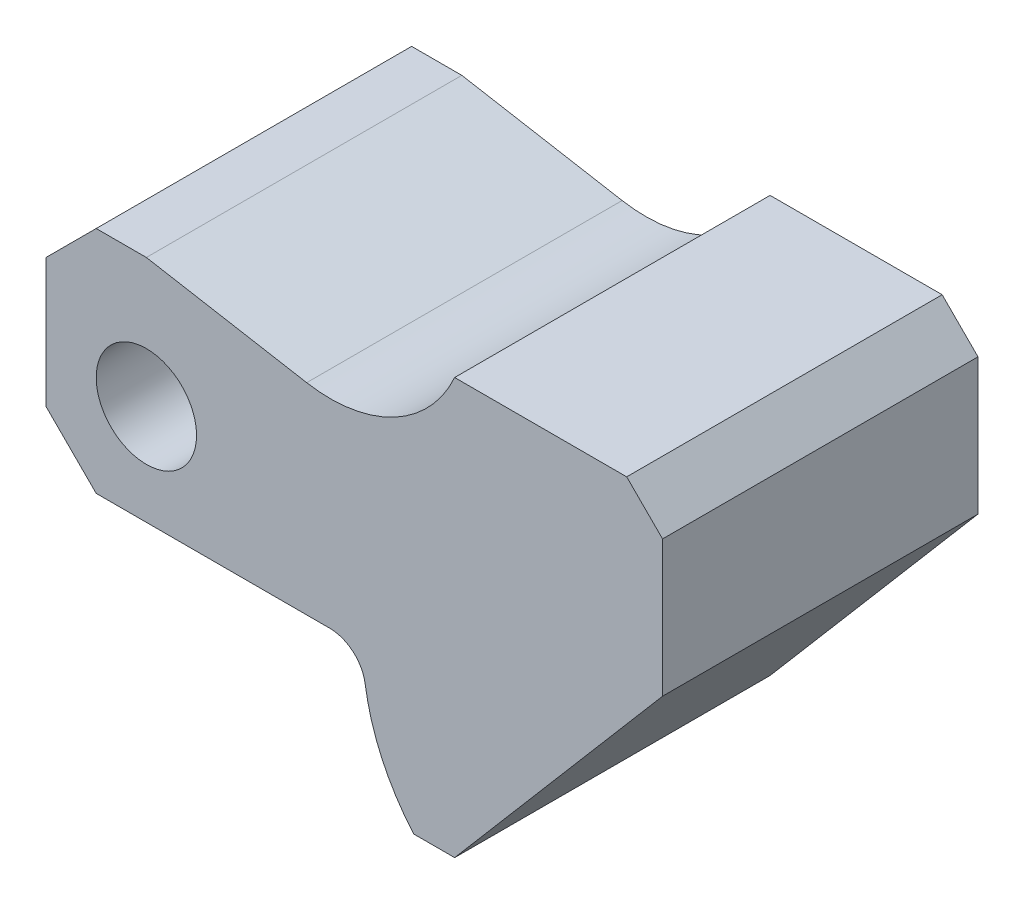
ISO-10303-21;
HEADER;
FILE_DESCRIPTION(('STEP AP214'),'2;1');
FILE_NAME('part.step','',(''),(''),'','','');
FILE_SCHEMA(('AUTOMOTIVE_DESIGN { 1 0 10303 214 1 1 1 1 }'));
ENDSEC;
DATA;
#1=APPLICATION_CONTEXT('core data for automotive mechanical design processes');
#2=APPLICATION_PROTOCOL_DEFINITION('international standard','automotive_design',2000,#1);
#3=PRODUCT_CONTEXT('',#1,'mechanical');
#4=PRODUCT('Part','Part','',(#3));
#5=PRODUCT_RELATED_PRODUCT_CATEGORY('part','',(#4));
#6=PRODUCT_DEFINITION_FORMATION('','',#4);
#7=PRODUCT_DEFINITION_CONTEXT('part definition',#1,'design');
#8=PRODUCT_DEFINITION('design','',#6,#7);
#9=PRODUCT_DEFINITION_SHAPE('','',#8);
#10=(LENGTH_UNIT() NAMED_UNIT(*) SI_UNIT(.MILLI.,.METRE.));
#11=(NAMED_UNIT(*) PLANE_ANGLE_UNIT() SI_UNIT($,.RADIAN.));
#12=(NAMED_UNIT(*) SI_UNIT($,.STERADIAN.) SOLID_ANGLE_UNIT());
#13=UNCERTAINTY_MEASURE_WITH_UNIT(LENGTH_MEASURE(1.E-05),#10,'distance_accuracy_value','');
#14=(GEOMETRIC_REPRESENTATION_CONTEXT(3) GLOBAL_UNCERTAINTY_ASSIGNED_CONTEXT((#13)) GLOBAL_UNIT_ASSIGNED_CONTEXT((#10,
#11,#12)) REPRESENTATION_CONTEXT('',''));
#15=CARTESIAN_POINT('',(0.,0.,0.));
#16=DIRECTION('',(0.,0.,1.));
#17=DIRECTION('',(1.,0.,0.));
#18=AXIS2_PLACEMENT_3D('',#15,#16,#17);
#19=CARTESIAN_POINT('',(-153.475211561993,21.7593578120713,44.));
#20=DIRECTION('',(0.,1.,0.));
#21=DIRECTION('',(-1.,0.,0.));
#22=AXIS2_PLACEMENT_3D('',#19,#20,#21);
#23=PLANE('',#22);
#24=DIRECTION('',(1.,0.,0.));
#25=VECTOR('',#24,1.);
#26=CARTESIAN_POINT('',(-153.475211561993,21.7593578120713,44.));
#27=LINE('',#26,#25);
#28=CARTESIAN_POINT('',(-146.475211561993,21.7593578120713,44.));
#29=VERTEX_POINT('',#28);
#30=CARTESIAN_POINT('',(-113.899672650652,21.7593578120713,44.));
#31=VERTEX_POINT('',#30);
#32=EDGE_CURVE('E146',#29,#31,#27,.T.);
#33=ORIENTED_EDGE('',*,*,#32,.F.);
#34=DIRECTION('',(0.,0.,-1.));
#35=VECTOR('',#34,1.);
#36=CARTESIAN_POINT('',(-146.475211561993,21.7593578120713,44.));
#37=LINE('',#36,#35);
#38=CARTESIAN_POINT('',(-146.475211561993,21.7593578120713,0.));
#39=VERTEX_POINT('',#38);
#40=EDGE_CURVE('E186',#29,#39,#37,.T.);
#41=ORIENTED_EDGE('',*,*,#40,.T.);
#42=DIRECTION('',(1.,0.,0.));
#43=VECTOR('',#42,1.);
#44=CARTESIAN_POINT('',(-153.475211561993,21.7593578120713,0.));
#45=LINE('',#44,#43);
#46=CARTESIAN_POINT('',(-113.899672650652,21.7593578120713,0.));
#47=VERTEX_POINT('',#46);
#48=EDGE_CURVE('E170',#39,#47,#45,.T.);
#49=ORIENTED_EDGE('',*,*,#48,.T.);
#50=DIRECTION('',(0.,0.,-1.));
#51=VECTOR('',#50,1.);
#52=CARTESIAN_POINT('',(-113.899672650652,21.7593578120713,44.));
#53=LINE('',#52,#51);
#54=EDGE_CURVE('E163',#31,#47,#53,.T.);
#55=ORIENTED_EDGE('',*,*,#54,.F.);
#56=EDGE_LOOP('',(#33,#41,#49,#55));
#57=FACE_BOUND('',#56,.T.);
#58=ADVANCED_FACE('F45',(#57),#23,.F.);
#59=CARTESIAN_POINT('',(-113.899672650652,16.7593578120713,44.));
#60=DIRECTION('',(0.,0.,-1.));
#61=DIRECTION('',(-1.,0.,0.));
#62=AXIS2_PLACEMENT_3D('',#59,#60,#61);
#63=CYLINDRICAL_SURFACE('',#62,5.);
#64=CARTESIAN_POINT('',(-113.899672650652,16.7593578120713,0.));
#65=DIRECTION('',(0.,0.,-1.));
#66=DIRECTION('',(-1.,0.,0.));
#67=AXIS2_PLACEMENT_3D('',#64,#65,#66);
#68=CIRCLE('',#67,5.);
#69=CARTESIAN_POINT('',(-108.95403390924,17.4946519297184,0.));
#70=VERTEX_POINT('',#69);
#71=EDGE_CURVE('E252',#47,#70,#68,.T.);
#72=ORIENTED_EDGE('',*,*,#71,.T.);
#73=DIRECTION('',(0.,0.,-1.));
#74=VECTOR('',#73,1.);
#75=CARTESIAN_POINT('',(-108.95403390924,17.4946519297184,44.));
#76=LINE('',#75,#74);
#77=CARTESIAN_POINT('',(-108.95403390924,17.4946519297184,44.));
#78=VERTEX_POINT('',#77);
#79=EDGE_CURVE('E165',#78,#70,#76,.T.);
#80=ORIENTED_EDGE('',*,*,#79,.F.);
#81=CARTESIAN_POINT('',(-113.899672650652,16.7593578120713,44.));
#82=DIRECTION('',(0.,0.,-1.));
#83=DIRECTION('',(-1.,0.,0.));
#84=AXIS2_PLACEMENT_3D('',#81,#82,#83);
#85=CIRCLE('',#84,5.);
#86=EDGE_CURVE('E149',#31,#78,#85,.T.);
#87=ORIENTED_EDGE('',*,*,#86,.F.);
#88=ORIENTED_EDGE('',*,*,#54,.T.);
#89=EDGE_LOOP('',(#72,#80,#87,#88));
#90=FACE_BOUND('',#89,.T.);
#91=ADVANCED_FACE('F162',(#90),#63,.F.);
#92=CARTESIAN_POINT('',(-80.2693292090515,21.7593578120713,44.));
#93=DIRECTION('',(0.,0.,-1.));
#94=DIRECTION('',(-1.,0.,0.));
#95=AXIS2_PLACEMENT_3D('',#92,#93,#94);
#96=CYLINDRICAL_SURFACE('',#95,29.);
#97=CARTESIAN_POINT('',(-80.2693292090515,21.7593578120713,0.));
#98=DIRECTION('',(0.,0.,1.));
#99=DIRECTION('',(1.,0.,0.));
#100=AXIS2_PLACEMENT_3D('',#97,#98,#99);
#101=CIRCLE('',#100,29.);
#102=CARTESIAN_POINT('',(-102.178231509258,2.75935781207131,0.));
#103=VERTEX_POINT('',#102);
#104=EDGE_CURVE('E250',#70,#103,#101,.T.);
#105=ORIENTED_EDGE('',*,*,#104,.T.);
#106=DIRECTION('',(0.,0.,-1.));
#107=VECTOR('',#106,1.);
#108=CARTESIAN_POINT('',(-102.178231509258,2.75935781207131,44.));
#109=LINE('',#108,#107);
#110=CARTESIAN_POINT('',(-102.178231509258,2.75935781207131,44.));
#111=VERTEX_POINT('',#110);
#112=EDGE_CURVE('E177',#111,#103,#109,.T.);
#113=ORIENTED_EDGE('',*,*,#112,.F.);
#114=CARTESIAN_POINT('',(-80.2693292090515,21.7593578120713,44.));
#115=DIRECTION('',(0.,0.,1.));
#116=DIRECTION('',(1.,0.,0.));
#117=AXIS2_PLACEMENT_3D('',#114,#115,#116);
#118=CIRCLE('',#117,29.);
#119=EDGE_CURVE('E167',#78,#111,#118,.T.);
#120=ORIENTED_EDGE('',*,*,#119,.F.);
#121=ORIENTED_EDGE('',*,*,#79,.T.);
#122=EDGE_LOOP('',(#105,#113,#120,#121));
#123=FACE_BOUND('',#122,.T.);
#124=ADVANCED_FACE('F302',(#123),#96,.T.);
#125=CARTESIAN_POINT('',(-96.4752115619927,2.75935781207131,44.));
#126=DIRECTION('',(0.,1.,0.));
#127=DIRECTION('',(0.,0.,1.));
#128=AXIS2_PLACEMENT_3D('',#125,#126,#127);
#129=PLANE('',#128);
#130=DIRECTION('',(1.,0.,0.));
#131=VECTOR('',#130,1.);
#132=CARTESIAN_POINT('',(-96.4752115619927,2.75935781207131,0.));
#133=LINE('',#132,#131);
#134=CARTESIAN_POINT('',(-96.4752115619927,2.75935781207131,0.));
#135=VERTEX_POINT('',#134);
#136=EDGE_CURVE('E245',#103,#135,#133,.T.);
#137=ORIENTED_EDGE('',*,*,#136,.T.);
#138=DIRECTION('',(0.,0.,-1.));
#139=VECTOR('',#138,1.);
#140=CARTESIAN_POINT('',(-96.4752115619927,2.75935781207131,44.));
#141=LINE('',#140,#139);
#142=CARTESIAN_POINT('',(-96.4752115619927,2.75935781207131,44.));
#143=VERTEX_POINT('',#142);
#144=EDGE_CURVE('E236',#143,#135,#141,.T.);
#145=ORIENTED_EDGE('',*,*,#144,.F.);
#146=DIRECTION('',(1.,0.,0.));
#147=VECTOR('',#146,1.);
#148=CARTESIAN_POINT('',(-96.4752115619927,2.75935781207131,44.));
#149=LINE('',#148,#147);
#150=EDGE_CURVE('E246',#111,#143,#149,.T.);
#151=ORIENTED_EDGE('',*,*,#150,.F.);
#152=ORIENTED_EDGE('',*,*,#112,.T.);
#153=EDGE_LOOP('',(#137,#145,#151,#152));
#154=FACE_BOUND('',#153,.T.);
#155=ADVANCED_FACE('F243',(#154),#129,.F.);
#156=CARTESIAN_POINT('',(-67.4752115619927,36.7593578120713,44.));
#157=DIRECTION('',(-0.760833951959086,0.64894660608275,0.));
#158=DIRECTION('',(-0.64894660608275,-0.760833951959086,0.));
#159=AXIS2_PLACEMENT_3D('',#156,#157,#158);
#160=PLANE('',#159);
#161=DIRECTION('',(0.64894660608275,0.760833951959086,0.));
#162=VECTOR('',#161,1.);
#163=CARTESIAN_POINT('',(-67.4752115619927,36.7593578120713,0.));
#164=LINE('',#163,#162);
#165=CARTESIAN_POINT('',(-67.4752115619927,36.7593578120713,0.));
#166=VERTEX_POINT('',#165);
#167=EDGE_CURVE('E214',#135,#166,#164,.T.);
#168=ORIENTED_EDGE('',*,*,#167,.T.);
#169=DIRECTION('',(0.,0.,-1.));
#170=VECTOR('',#169,1.);
#171=CARTESIAN_POINT('',(-67.4752115619927,36.7593578120713,44.));
#172=LINE('',#171,#170);
#173=CARTESIAN_POINT('',(-67.4752115619927,36.7593578120713,44.));
#174=VERTEX_POINT('',#173);
#175=EDGE_CURVE('E233',#174,#166,#172,.T.);
#176=ORIENTED_EDGE('',*,*,#175,.F.);
#177=DIRECTION('',(0.64894660608275,0.760833951959086,0.));
#178=VECTOR('',#177,1.);
#179=CARTESIAN_POINT('',(-67.4752115619927,36.7593578120713,44.));
#180=LINE('',#179,#178);
#181=EDGE_CURVE('E269',#143,#174,#180,.T.);
#182=ORIENTED_EDGE('',*,*,#181,.F.);
#183=ORIENTED_EDGE('',*,*,#144,.T.);
#184=EDGE_LOOP('',(#168,#176,#182,#183));
#185=FACE_BOUND('',#184,.T.);
#186=ADVANCED_FACE('F326',(#185),#160,.F.);
#187=CARTESIAN_POINT('',(-67.4752115619927,60.7593578120713,44.));
#188=DIRECTION('',(-1.,0.,0.));
#189=DIRECTION('',(0.,0.,1.));
#190=AXIS2_PLACEMENT_3D('',#187,#188,#189);
#191=PLANE('',#190);
#192=DIRECTION('',(0.,1.,0.));
#193=VECTOR('',#192,1.);
#194=CARTESIAN_POINT('',(-67.4752115619927,60.7593578120713,0.));
#195=LINE('',#194,#193);
#196=CARTESIAN_POINT('',(-67.4752115619927,55.7593578120713,0.));
#197=VERTEX_POINT('',#196);
#198=EDGE_CURVE('E210',#166,#197,#195,.T.);
#199=ORIENTED_EDGE('',*,*,#198,.T.);
#200=DIRECTION('',(0.,0.,1.));
#201=VECTOR('',#200,1.);
#202=CARTESIAN_POINT('',(-67.4752115619927,55.7593578120713,44.));
#203=LINE('',#202,#201);
#204=CARTESIAN_POINT('',(-67.4752115619927,55.7593578120713,44.));
#205=VERTEX_POINT('',#204);
#206=EDGE_CURVE('E54',#197,#205,#203,.T.);
#207=ORIENTED_EDGE('',*,*,#206,.T.);
#208=DIRECTION('',(0.,1.,0.));
#209=VECTOR('',#208,1.);
#210=CARTESIAN_POINT('',(-67.4752115619927,60.7593578120713,44.));
#211=LINE('',#210,#209);
#212=EDGE_CURVE('E267',#174,#205,#211,.T.);
#213=ORIENTED_EDGE('',*,*,#212,.F.);
#214=ORIENTED_EDGE('',*,*,#175,.T.);
#215=EDGE_LOOP('',(#199,#207,#213,#214));
#216=FACE_BOUND('',#215,.T.);
#217=ADVANCED_FACE('F327',(#216),#191,.F.);
#218=CARTESIAN_POINT('',(-96.4752115619927,60.7593578120713,44.));
#219=DIRECTION('',(0.,-1.,0.));
#220=DIRECTION('',(0.,0.,-1.));
#221=AXIS2_PLACEMENT_3D('',#218,#219,#220);
#222=PLANE('',#221);
#223=DIRECTION('',(-1.,0.,0.));
#224=VECTOR('',#223,1.);
#225=CARTESIAN_POINT('',(-96.4752115619927,60.7593578120713,44.));
#226=LINE('',#225,#224);
#227=CARTESIAN_POINT('',(-72.4752115619927,60.7593578120713,44.));
#228=VERTEX_POINT('',#227);
#229=CARTESIAN_POINT('',(-96.4752115619927,60.7593578120713,44.));
#230=VERTEX_POINT('',#229);
#231=EDGE_CURVE('E203',#228,#230,#226,.T.);
#232=ORIENTED_EDGE('',*,*,#231,.F.);
#233=DIRECTION('',(0.,0.,-1.));
#234=VECTOR('',#233,1.);
#235=CARTESIAN_POINT('',(-72.4752115619927,60.7593578120713,44.));
#236=LINE('',#235,#234);
#237=CARTESIAN_POINT('',(-72.4752115619927,60.7593578120713,0.));
#238=VERTEX_POINT('',#237);
#239=EDGE_CURVE('E193',#228,#238,#236,.T.);
#240=ORIENTED_EDGE('',*,*,#239,.T.);
#241=DIRECTION('',(-1.,0.,0.));
#242=VECTOR('',#241,1.);
#243=CARTESIAN_POINT('',(-96.4752115619927,60.7593578120713,0.));
#244=LINE('',#243,#242);
#245=CARTESIAN_POINT('',(-96.4752115619927,60.7593578120713,0.));
#246=VERTEX_POINT('',#245);
#247=EDGE_CURVE('E201',#238,#246,#244,.T.);
#248=ORIENTED_EDGE('',*,*,#247,.T.);
#249=DIRECTION('',(0.,0.,-1.));
#250=VECTOR('',#249,1.);
#251=CARTESIAN_POINT('',(-96.4752115619927,60.7593578120713,44.));
#252=LINE('',#251,#250);
#253=EDGE_CURVE('E231',#230,#246,#252,.T.);
#254=ORIENTED_EDGE('',*,*,#253,.F.);
#255=EDGE_LOOP('',(#232,#240,#248,#254));
#256=FACE_BOUND('',#255,.T.);
#257=ADVANCED_FACE('F199',(#256),#222,.F.);
#258=CARTESIAN_POINT('',(-113.814515350544,68.5277903520585,44.));
#259=DIRECTION('',(0.,0.,-1.));
#260=DIRECTION('',(-1.,0.,0.));
#261=AXIS2_PLACEMENT_3D('',#258,#259,#260);
#262=CYLINDRICAL_SURFACE('',#261,19.);
#263=CARTESIAN_POINT('',(-113.814515350544,68.5277903520585,0.));
#264=DIRECTION('',(0.,0.,-1.));
#265=DIRECTION('',(1.,0.,0.));
#266=AXIS2_PLACEMENT_3D('',#263,#264,#265);
#267=CIRCLE('',#266,19.);
#268=CARTESIAN_POINT('',(-117.113830726216,49.8164430448266,0.));
#269=VERTEX_POINT('',#268);
#270=EDGE_CURVE('E209',#246,#269,#267,.T.);
#271=ORIENTED_EDGE('',*,*,#270,.T.);
#272=DIRECTION('',(0.,0.,-1.));
#273=VECTOR('',#272,1.);
#274=CARTESIAN_POINT('',(-117.113830726216,49.8164430448266,44.));
#275=LINE('',#274,#273);
#276=CARTESIAN_POINT('',(-117.113830726216,49.8164430448266,44.));
#277=VERTEX_POINT('',#276);
#278=EDGE_CURVE('E227',#277,#269,#275,.T.);
#279=ORIENTED_EDGE('',*,*,#278,.F.);
#280=CARTESIAN_POINT('',(-113.814515350544,68.5277903520585,44.));
#281=DIRECTION('',(0.,0.,-1.));
#282=DIRECTION('',(1.,0.,0.));
#283=AXIS2_PLACEMENT_3D('',#280,#281,#282);
#284=CIRCLE('',#283,19.);
#285=EDGE_CURVE('E264',#230,#277,#284,.T.);
#286=ORIENTED_EDGE('',*,*,#285,.F.);
#287=ORIENTED_EDGE('',*,*,#253,.T.);
#288=EDGE_LOOP('',(#271,#279,#286,#287));
#289=FACE_BOUND('',#288,.T.);
#290=ADVANCED_FACE('F331',(#289),#262,.F.);
#291=CARTESIAN_POINT('',(-139.475211561993,53.7593578120713,44.));
#292=DIRECTION('',(-0.173648177666931,-0.984807753012208,0.));
#293=DIRECTION('',(0.984807753012208,-0.173648177666931,0.));
#294=AXIS2_PLACEMENT_3D('',#291,#292,#293);
#295=PLANE('',#294);
#296=DIRECTION('',(-0.984807753012208,0.173648177666931,0.));
#297=VECTOR('',#296,1.);
#298=CARTESIAN_POINT('',(-139.475211561993,53.7593578120713,0.));
#299=LINE('',#298,#297);
#300=CARTESIAN_POINT('',(-139.475211561993,53.7593578120713,0.));
#301=VERTEX_POINT('',#300);
#302=EDGE_CURVE('E212',#269,#301,#299,.T.);
#303=ORIENTED_EDGE('',*,*,#302,.T.);
#304=DIRECTION('',(0.,0.,-1.));
#305=VECTOR('',#304,1.);
#306=CARTESIAN_POINT('',(-139.475211561993,53.7593578120713,44.));
#307=LINE('',#306,#305);
#308=CARTESIAN_POINT('',(-139.475211561993,53.7593578120713,44.));
#309=VERTEX_POINT('',#308);
#310=EDGE_CURVE('E224',#309,#301,#307,.T.);
#311=ORIENTED_EDGE('',*,*,#310,.F.);
#312=DIRECTION('',(-0.984807753012208,0.173648177666931,0.));
#313=VECTOR('',#312,1.);
#314=CARTESIAN_POINT('',(-139.475211561993,53.7593578120713,44.));
#315=LINE('',#314,#313);
#316=EDGE_CURVE('E262',#277,#309,#315,.T.);
#317=ORIENTED_EDGE('',*,*,#316,.F.);
#318=ORIENTED_EDGE('',*,*,#278,.T.);
#319=EDGE_LOOP('',(#303,#311,#317,#318));
#320=FACE_BOUND('',#319,.T.);
#321=ADVANCED_FACE('F335',(#320),#295,.F.);
#322=CARTESIAN_POINT('',(-153.475211561993,53.7593578120713,44.));
#323=DIRECTION('',(0.,-1.,0.));
#324=DIRECTION('',(0.,0.,-1.));
#325=AXIS2_PLACEMENT_3D('',#322,#323,#324);
#326=PLANE('',#325);
#327=DIRECTION('',(-1.,0.,0.));
#328=VECTOR('',#327,1.);
#329=CARTESIAN_POINT('',(-153.475211561993,53.7593578120713,0.));
#330=LINE('',#329,#328);
#331=CARTESIAN_POINT('',(-146.475211561993,53.7593578120713,0.));
#332=VERTEX_POINT('',#331);
#333=EDGE_CURVE('E219',#301,#332,#330,.T.);
#334=ORIENTED_EDGE('',*,*,#333,.T.);
#335=DIRECTION('',(0.,0.,1.));
#336=VECTOR('',#335,1.);
#337=CARTESIAN_POINT('',(-146.475211561993,53.7593578120713,44.));
#338=LINE('',#337,#336);
#339=CARTESIAN_POINT('',(-146.475211561993,53.7593578120713,44.));
#340=VERTEX_POINT('',#339);
#341=EDGE_CURVE('E182',#332,#340,#338,.T.);
#342=ORIENTED_EDGE('',*,*,#341,.T.);
#343=DIRECTION('',(-1.,0.,0.));
#344=VECTOR('',#343,1.);
#345=CARTESIAN_POINT('',(-153.475211561993,53.7593578120713,44.));
#346=LINE('',#345,#344);
#347=EDGE_CURVE('E259',#309,#340,#346,.T.);
#348=ORIENTED_EDGE('',*,*,#347,.F.);
#349=ORIENTED_EDGE('',*,*,#310,.T.);
#350=EDGE_LOOP('',(#334,#342,#348,#349));
#351=FACE_BOUND('',#350,.T.);
#352=ADVANCED_FACE('F292',(#351),#326,.F.);
#353=CARTESIAN_POINT('',(-153.475211561993,21.7593578120713,44.));
#354=DIRECTION('',(1.,0.,0.));
#355=DIRECTION('',(0.,0.,-1.));
#356=AXIS2_PLACEMENT_3D('',#353,#354,#355);
#357=PLANE('',#356);
#358=DIRECTION('',(0.,-1.,0.));
#359=VECTOR('',#358,1.);
#360=CARTESIAN_POINT('',(-153.475211561993,21.7593578120713,0.));
#361=LINE('',#360,#359);
#362=CARTESIAN_POINT('',(-153.475211561993,46.7593578120713,0.));
#363=VERTEX_POINT('',#362);
#364=CARTESIAN_POINT('',(-153.475211561993,28.7593578120713,0.));
#365=VERTEX_POINT('',#364);
#366=EDGE_CURVE('E158',#363,#365,#361,.T.);
#367=ORIENTED_EDGE('',*,*,#366,.T.);
#368=DIRECTION('',(0.,0.,1.));
#369=VECTOR('',#368,1.);
#370=CARTESIAN_POINT('',(-153.475211561993,28.7593578120713,44.));
#371=LINE('',#370,#369);
#372=CARTESIAN_POINT('',(-153.475211561993,28.7593578120713,44.));
#373=VERTEX_POINT('',#372);
#374=EDGE_CURVE('E190',#365,#373,#371,.T.);
#375=ORIENTED_EDGE('',*,*,#374,.T.);
#376=DIRECTION('',(0.,-1.,0.));
#377=VECTOR('',#376,1.);
#378=CARTESIAN_POINT('',(-153.475211561993,21.7593578120713,44.));
#379=LINE('',#378,#377);
#380=CARTESIAN_POINT('',(-153.475211561993,46.7593578120713,44.));
#381=VERTEX_POINT('',#380);
#382=EDGE_CURVE('E228',#381,#373,#379,.T.);
#383=ORIENTED_EDGE('',*,*,#382,.F.);
#384=DIRECTION('',(0.,0.,-1.));
#385=VECTOR('',#384,1.);
#386=CARTESIAN_POINT('',(-153.475211561993,46.7593578120713,44.));
#387=LINE('',#386,#385);
#388=EDGE_CURVE('E172',#381,#363,#387,.T.);
#389=ORIENTED_EDGE('',*,*,#388,.T.);
#390=EDGE_LOOP('',(#367,#375,#383,#389));
#391=FACE_BOUND('',#390,.T.);
#392=ADVANCED_FACE('F283',(#391),#357,.F.);
#393=CARTESIAN_POINT('',(-113.899672650652,16.7593578120713,44.));
#394=DIRECTION('',(0.,0.,-1.));
#395=DIRECTION('',(-1.,0.,0.));
#396=AXIS2_PLACEMENT_3D('',#393,#394,#395);
#397=PLANE('',#396);
#398=CARTESIAN_POINT('',(-139.475211561993,35.7593578120713,44.));
#399=DIRECTION('',(0.,0.,1.));
#400=DIRECTION('',(1.,0.,0.));
#401=AXIS2_PLACEMENT_3D('',#398,#399,#400);
#402=CIRCLE('',#401,7.00000000000002);
#403=CARTESIAN_POINT('',(-132.475211561993,35.7593578120713,44.));
#404=VERTEX_POINT('',#403);
#405=EDGE_CURVE('E257',#404,#404,#402,.T.);
#406=ORIENTED_EDGE('',*,*,#405,.F.);
#407=EDGE_LOOP('',(#406));
#408=FACE_BOUND('',#407,.T.);
#409=ORIENTED_EDGE('',*,*,#212,.T.);
#410=DIRECTION('',(0.707106781186546,-0.70710678118655,0.));
#411=VECTOR('',#410,1.);
#412=CARTESIAN_POINT('',(-72.4752115619927,60.7593578120713,44.));
#413=LINE('',#412,#411);
#414=EDGE_CURVE('E11',#205,#228,#413,.F.);
#415=ORIENTED_EDGE('',*,*,#414,.T.);
#416=ORIENTED_EDGE('',*,*,#231,.T.);
#417=ORIENTED_EDGE('',*,*,#285,.T.);
#418=ORIENTED_EDGE('',*,*,#316,.T.);
#419=ORIENTED_EDGE('',*,*,#347,.T.);
#420=DIRECTION('',(0.70710678118655,0.707106781186545,0.));
#421=VECTOR('',#420,1.);
#422=CARTESIAN_POINT('',(-153.475211561993,46.7593578120713,44.));
#423=LINE('',#422,#421);
#424=EDGE_CURVE('E184',#340,#381,#423,.F.);
#425=ORIENTED_EDGE('',*,*,#424,.T.);
#426=ORIENTED_EDGE('',*,*,#382,.T.);
#427=DIRECTION('',(-0.707106781186547,0.707106781186548,0.));
#428=VECTOR('',#427,1.);
#429=CARTESIAN_POINT('',(-146.475211561993,21.7593578120713,44.));
#430=LINE('',#429,#428);
#431=EDGE_CURVE('E153',#373,#29,#430,.F.);
#432=ORIENTED_EDGE('',*,*,#431,.T.);
#433=ORIENTED_EDGE('',*,*,#32,.T.);
#434=ORIENTED_EDGE('',*,*,#86,.T.);
#435=ORIENTED_EDGE('',*,*,#119,.T.);
#436=ORIENTED_EDGE('',*,*,#150,.T.);
#437=ORIENTED_EDGE('',*,*,#181,.T.);
#438=EDGE_LOOP('',(#409,#415,#416,#417,#418,#419,#425,#426,#432,#433,#434,#435,#436,#437));
#439=FACE_BOUND('',#438,.T.);
#440=ADVANCED_FACE('F148',(#408,#439),#397,.F.);
#441=CARTESIAN_POINT('',(-113.899672650652,16.7593578120713,0.));
#442=DIRECTION('',(0.,0.,-1.));
#443=DIRECTION('',(-1.,0.,0.));
#444=AXIS2_PLACEMENT_3D('',#441,#442,#443);
#445=PLANE('',#444);
#446=CARTESIAN_POINT('',(-139.475211561993,35.7593578120713,0.));
#447=DIRECTION('',(0.,0.,1.));
#448=DIRECTION('',(1.,0.,0.));
#449=AXIS2_PLACEMENT_3D('',#446,#447,#448);
#450=CIRCLE('',#449,7.00000000000002);
#451=CARTESIAN_POINT('',(-132.475211561993,35.7593578120713,0.));
#452=VERTEX_POINT('',#451);
#453=EDGE_CURVE('E273',#452,#452,#450,.T.);
#454=ORIENTED_EDGE('',*,*,#453,.T.);
#455=EDGE_LOOP('',(#454));
#456=FACE_BOUND('',#455,.T.);
#457=ORIENTED_EDGE('',*,*,#247,.F.);
#458=DIRECTION('',(-0.707106781186546,0.70710678118655,0.));
#459=VECTOR('',#458,1.);
#460=CARTESIAN_POINT('',(-71.1874421063222,59.4715883564008,0.));
#461=LINE('',#460,#459);
#462=EDGE_CURVE('E68',#238,#197,#461,.F.);
#463=ORIENTED_EDGE('',*,*,#462,.T.);
#464=ORIENTED_EDGE('',*,*,#198,.F.);
#465=ORIENTED_EDGE('',*,*,#167,.F.);
#466=ORIENTED_EDGE('',*,*,#136,.F.);
#467=ORIENTED_EDGE('',*,*,#104,.F.);
#468=ORIENTED_EDGE('',*,*,#71,.F.);
#469=ORIENTED_EDGE('',*,*,#48,.F.);
#470=DIRECTION('',(0.707106781186547,-0.707106781186548,0.));
#471=VECTOR('',#470,1.);
#472=CARTESIAN_POINT('',(-127.687442106322,2.97158835640096,0.));
#473=LINE('',#472,#471);
#474=EDGE_CURVE('E188',#39,#365,#473,.F.);
#475=ORIENTED_EDGE('',*,*,#474,.T.);
#476=ORIENTED_EDGE('',*,*,#366,.F.);
#477=DIRECTION('',(-0.70710678118655,-0.707106781186545,0.));
#478=VECTOR('',#477,1.);
#479=CARTESIAN_POINT('',(-148.687442106322,51.5471272677417,0.));
#480=LINE('',#479,#478);
#481=EDGE_CURVE('E175',#363,#332,#480,.F.);
#482=ORIENTED_EDGE('',*,*,#481,.T.);
#483=ORIENTED_EDGE('',*,*,#333,.F.);
#484=ORIENTED_EDGE('',*,*,#302,.F.);
#485=ORIENTED_EDGE('',*,*,#270,.F.);
#486=EDGE_LOOP('',(#457,#463,#464,#465,#466,#467,#468,#469,#475,#476,#482,#483,#484,#485));
#487=FACE_BOUND('',#486,.T.);
#488=ADVANCED_FACE('F207',(#456,#487),#445,.T.);
#489=CARTESIAN_POINT('',(-139.475211561993,35.7593578120713,44.));
#490=DIRECTION('',(0.,0.,-1.));
#491=DIRECTION('',(-1.,0.,0.));
#492=AXIS2_PLACEMENT_3D('',#489,#490,#491);
#493=CYLINDRICAL_SURFACE('',#492,7.00000000000002);
#494=ORIENTED_EDGE('',*,*,#405,.T.);
#495=EDGE_LOOP('',(#494));
#496=FACE_BOUND('',#495,.T.);
#497=ORIENTED_EDGE('',*,*,#453,.F.);
#498=EDGE_LOOP('',(#497));
#499=FACE_BOUND('',#498,.T.);
#500=ADVANCED_FACE('F279',(#496,#499),#493,.F.);
#501=CARTESIAN_POINT('',(-153.475211561993,46.7593578120713,44.));
#502=DIRECTION('',(0.707106781186545,-0.70710678118655,0.));
#503=DIRECTION('',(0.,0.,-1.));
#504=AXIS2_PLACEMENT_3D('',#501,#502,#503);
#505=PLANE('',#504);
#506=ORIENTED_EDGE('',*,*,#424,.F.);
#507=ORIENTED_EDGE('',*,*,#341,.F.);
#508=ORIENTED_EDGE('',*,*,#481,.F.);
#509=ORIENTED_EDGE('',*,*,#388,.F.);
#510=EDGE_LOOP('',(#506,#507,#508,#509));
#511=FACE_BOUND('',#510,.T.);
#512=ADVANCED_FACE('F307',(#511),#505,.F.);
#513=CARTESIAN_POINT('',(-146.475211561993,21.7593578120713,44.));
#514=DIRECTION('',(0.707106781186548,0.707106781186547,0.));
#515=DIRECTION('',(0.,0.,-1.));
#516=AXIS2_PLACEMENT_3D('',#513,#514,#515);
#517=PLANE('',#516);
#518=ORIENTED_EDGE('',*,*,#431,.F.);
#519=ORIENTED_EDGE('',*,*,#374,.F.);
#520=ORIENTED_EDGE('',*,*,#474,.F.);
#521=ORIENTED_EDGE('',*,*,#40,.F.);
#522=EDGE_LOOP('',(#518,#519,#520,#521));
#523=FACE_BOUND('',#522,.T.);
#524=ADVANCED_FACE('F311',(#523),#517,.F.);
#525=CARTESIAN_POINT('',(-72.4752115619927,60.7593578120713,44.));
#526=DIRECTION('',(-0.707106781186549,-0.707106781186545,0.));
#527=DIRECTION('',(0.,0.,-1.));
#528=AXIS2_PLACEMENT_3D('',#525,#526,#527);
#529=PLANE('',#528);
#530=ORIENTED_EDGE('',*,*,#414,.F.);
#531=ORIENTED_EDGE('',*,*,#206,.F.);
#532=ORIENTED_EDGE('',*,*,#462,.F.);
#533=ORIENTED_EDGE('',*,*,#239,.F.);
#534=EDGE_LOOP('',(#530,#531,#532,#533));
#535=FACE_BOUND('',#534,.T.);
#536=ADVANCED_FACE('F48',(#535),#529,.F.);
#537=CLOSED_SHELL('',(#58,#91,#124,#155,#186,#217,#257,#290,#321,#352,#392,#440,#488,#500,#512,
#524,#536));
#538=MANIFOLD_SOLID_BREP('B2',#537);
#539=ADVANCED_BREP_SHAPE_REPRESENTATION('',(#18,#538),#14);
#540=SHAPE_DEFINITION_REPRESENTATION(#9,#539);
ENDSEC;
END-ISO-10303-21;
